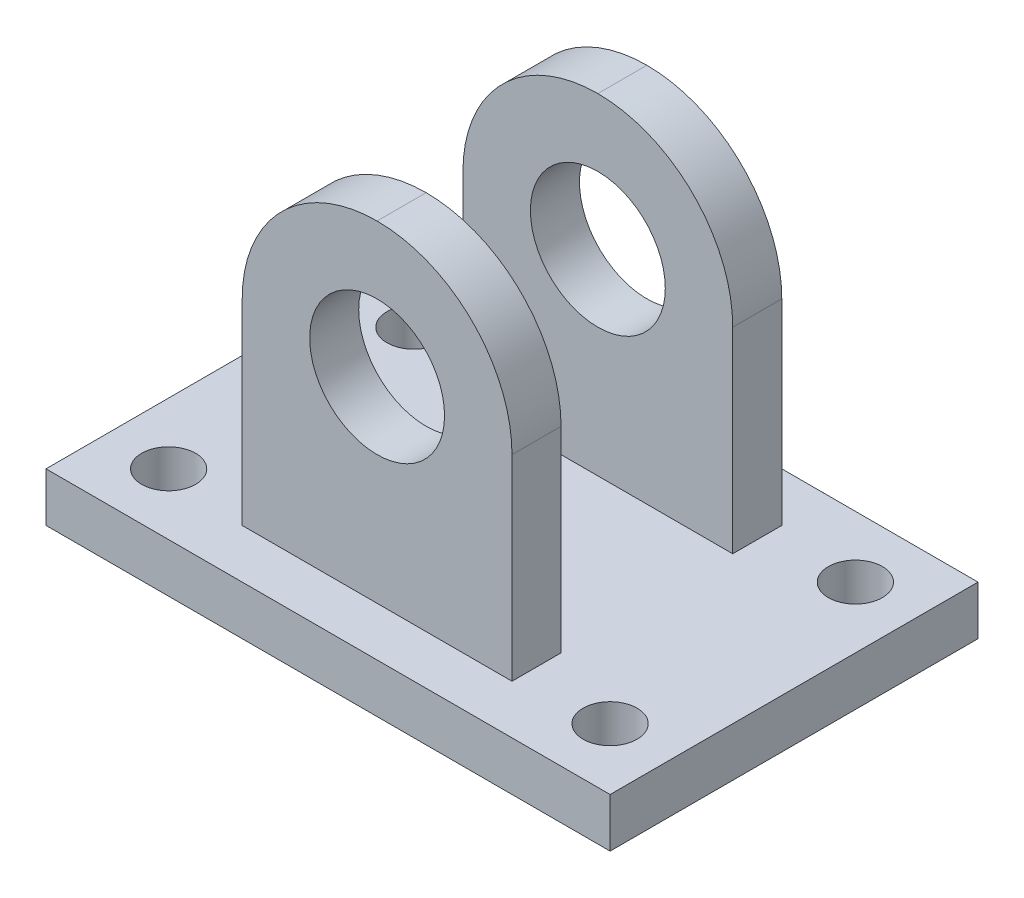
ISO-10303-21;
HEADER;
FILE_DESCRIPTION(('STEP AP214'),'2;1');
FILE_NAME('part.step','',(''),(''),'','','');
FILE_SCHEMA(('AUTOMOTIVE_DESIGN { 1 0 10303 214 1 1 1 1 }'));
ENDSEC;
DATA;
#1=APPLICATION_CONTEXT('core data for automotive mechanical design processes');
#2=APPLICATION_PROTOCOL_DEFINITION('international standard','automotive_design',2000,#1);
#3=PRODUCT_CONTEXT('',#1,'mechanical');
#4=PRODUCT('Part','Part','',(#3));
#5=PRODUCT_RELATED_PRODUCT_CATEGORY('part','',(#4));
#6=PRODUCT_DEFINITION_FORMATION('','',#4);
#7=PRODUCT_DEFINITION_CONTEXT('part definition',#1,'design');
#8=PRODUCT_DEFINITION('design','',#6,#7);
#9=PRODUCT_DEFINITION_SHAPE('','',#8);
#10=(LENGTH_UNIT() NAMED_UNIT(*) SI_UNIT(.MILLI.,.METRE.));
#11=(NAMED_UNIT(*) PLANE_ANGLE_UNIT() SI_UNIT($,.RADIAN.));
#12=(NAMED_UNIT(*) SI_UNIT($,.STERADIAN.) SOLID_ANGLE_UNIT());
#13=UNCERTAINTY_MEASURE_WITH_UNIT(LENGTH_MEASURE(1.E-05),#10,'distance_accuracy_value','');
#14=(GEOMETRIC_REPRESENTATION_CONTEXT(3) GLOBAL_UNCERTAINTY_ASSIGNED_CONTEXT((#13)) GLOBAL_UNIT_ASSIGNED_CONTEXT((#10,
#11,#12)) REPRESENTATION_CONTEXT('',''));
#15=CARTESIAN_POINT('',(0.,0.,0.));
#16=DIRECTION('',(0.,0.,1.));
#17=DIRECTION('',(1.,0.,0.));
#18=AXIS2_PLACEMENT_3D('',#15,#16,#17);
#19=CARTESIAN_POINT('',(90.,0.,50.));
#20=DIRECTION('',(0.,1.,0.));
#21=DIRECTION('',(0.,0.,1.));
#22=AXIS2_PLACEMENT_3D('',#19,#20,#21);
#23=CYLINDRICAL_SURFACE('',#22,11.);
#24=CARTESIAN_POINT('',(90.,0.,50.));
#25=DIRECTION('',(0.,1.,0.));
#26=DIRECTION('',(0.,0.,1.));
#27=AXIS2_PLACEMENT_3D('',#24,#25,#26);
#28=CIRCLE('',#27,11.);
#29=CARTESIAN_POINT('',(90.,0.,61.));
#30=VERTEX_POINT('',#29);
#31=EDGE_CURVE('E42',#30,#30,#28,.T.);
#32=ORIENTED_EDGE('',*,*,#31,.F.);
#33=EDGE_LOOP('',(#32));
#34=FACE_BOUND('',#33,.T.);
#35=CARTESIAN_POINT('',(90.,20.,50.));
#36=DIRECTION('',(0.,1.,0.));
#37=DIRECTION('',(0.,0.,1.));
#38=AXIS2_PLACEMENT_3D('',#35,#36,#37);
#39=CIRCLE('',#38,11.);
#40=CARTESIAN_POINT('',(90.,20.,61.));
#41=VERTEX_POINT('',#40);
#42=EDGE_CURVE('E11',#41,#41,#39,.T.);
#43=ORIENTED_EDGE('',*,*,#42,.T.);
#44=EDGE_LOOP('',(#43));
#45=FACE_BOUND('',#44,.T.);
#46=ADVANCED_FACE('F35',(#34,#45),#23,.F.);
#47=CARTESIAN_POINT('',(-90.,0.,50.));
#48=DIRECTION('',(0.,1.,0.));
#49=DIRECTION('',(0.,0.,1.));
#50=AXIS2_PLACEMENT_3D('',#47,#48,#49);
#51=CYLINDRICAL_SURFACE('',#50,11.);
#52=CARTESIAN_POINT('',(-90.,0.,50.));
#53=DIRECTION('',(0.,1.,0.));
#54=DIRECTION('',(0.,0.,1.));
#55=AXIS2_PLACEMENT_3D('',#52,#53,#54);
#56=CIRCLE('',#55,11.);
#57=CARTESIAN_POINT('',(-90.,0.,61.));
#58=VERTEX_POINT('',#57);
#59=EDGE_CURVE('E243',#58,#58,#56,.T.);
#60=ORIENTED_EDGE('',*,*,#59,.F.);
#61=EDGE_LOOP('',(#60));
#62=FACE_BOUND('',#61,.T.);
#63=CARTESIAN_POINT('',(-90.,20.,50.));
#64=DIRECTION('',(0.,1.,0.));
#65=DIRECTION('',(0.,0.,1.));
#66=AXIS2_PLACEMENT_3D('',#63,#64,#65);
#67=CIRCLE('',#66,11.);
#68=CARTESIAN_POINT('',(-90.,20.,61.));
#69=VERTEX_POINT('',#68);
#70=EDGE_CURVE('E257',#69,#69,#67,.T.);
#71=ORIENTED_EDGE('',*,*,#70,.T.);
#72=EDGE_LOOP('',(#71));
#73=FACE_BOUND('',#72,.T.);
#74=ADVANCED_FACE('F266',(#62,#73),#51,.F.);
#75=CARTESIAN_POINT('',(0.,20.,0.));
#76=DIRECTION('',(0.,1.,0.));
#77=DIRECTION('',(0.,0.,1.));
#78=AXIS2_PLACEMENT_3D('',#75,#76,#77);
#79=PLANE('',#78);
#80=CARTESIAN_POINT('',(90.,20.,-50.));
#81=DIRECTION('',(0.,1.,0.));
#82=DIRECTION('',(0.,0.,1.));
#83=AXIS2_PLACEMENT_3D('',#80,#81,#82);
#84=CIRCLE('',#83,11.);
#85=CARTESIAN_POINT('',(90.,20.,-39.));
#86=VERTEX_POINT('',#85);
#87=EDGE_CURVE('E333',#86,#86,#84,.T.);
#88=ORIENTED_EDGE('',*,*,#87,.F.);
#89=EDGE_LOOP('',(#88));
#90=FACE_BOUND('',#89,.T.);
#91=CARTESIAN_POINT('',(-90.,20.,-50.));
#92=DIRECTION('',(0.,1.,0.));
#93=DIRECTION('',(0.,0.,1.));
#94=AXIS2_PLACEMENT_3D('',#91,#92,#93);
#95=CIRCLE('',#94,11.);
#96=CARTESIAN_POINT('',(-90.,20.,-39.));
#97=VERTEX_POINT('',#96);
#98=EDGE_CURVE('E330',#97,#97,#95,.T.);
#99=ORIENTED_EDGE('',*,*,#98,.F.);
#100=EDGE_LOOP('',(#99));
#101=FACE_BOUND('',#100,.T.);
#102=DIRECTION('',(0.,0.,-1.));
#103=VECTOR('',#102,1.);
#104=CARTESIAN_POINT('',(-55.,20.,55.));
#105=LINE('',#104,#103);
#106=CARTESIAN_POINT('',(-55.,20.,55.));
#107=VERTEX_POINT('',#106);
#108=CARTESIAN_POINT('',(-55.,20.,35.));
#109=VERTEX_POINT('',#108);
#110=EDGE_CURVE('E141',#107,#109,#105,.T.);
#111=ORIENTED_EDGE('',*,*,#110,.T.);
#112=DIRECTION('',(1.,0.,0.));
#113=VECTOR('',#112,1.);
#114=CARTESIAN_POINT('',(-55.,20.,35.));
#115=LINE('',#114,#113);
#116=CARTESIAN_POINT('',(55.,20.,35.));
#117=VERTEX_POINT('',#116);
#118=EDGE_CURVE('E147',#109,#117,#115,.T.);
#119=ORIENTED_EDGE('',*,*,#118,.T.);
#120=DIRECTION('',(0.,0.,1.));
#121=VECTOR('',#120,1.);
#122=CARTESIAN_POINT('',(55.,20.,55.));
#123=LINE('',#122,#121);
#124=CARTESIAN_POINT('',(55.,20.,55.));
#125=VERTEX_POINT('',#124);
#126=EDGE_CURVE('E161',#117,#125,#123,.T.);
#127=ORIENTED_EDGE('',*,*,#126,.T.);
#128=DIRECTION('',(-1.,0.,0.));
#129=VECTOR('',#128,1.);
#130=CARTESIAN_POINT('',(-55.,20.,55.));
#131=LINE('',#130,#129);
#132=EDGE_CURVE('E157',#125,#107,#131,.T.);
#133=ORIENTED_EDGE('',*,*,#132,.T.);
#134=EDGE_LOOP('',(#111,#119,#127,#133));
#135=FACE_BOUND('',#134,.T.);
#136=DIRECTION('',(0.,0.,1.));
#137=VECTOR('',#136,1.);
#138=CARTESIAN_POINT('',(-115.,20.,75.));
#139=LINE('',#138,#137);
#140=CARTESIAN_POINT('',(-115.,20.,-75.));
#141=VERTEX_POINT('',#140);
#142=CARTESIAN_POINT('',(-115.,20.,75.));
#143=VERTEX_POINT('',#142);
#144=EDGE_CURVE('E192',#141,#143,#139,.T.);
#145=ORIENTED_EDGE('',*,*,#144,.T.);
#146=DIRECTION('',(1.,0.,0.));
#147=VECTOR('',#146,1.);
#148=CARTESIAN_POINT('',(115.,20.,75.));
#149=LINE('',#148,#147);
#150=CARTESIAN_POINT('',(115.,20.,75.));
#151=VERTEX_POINT('',#150);
#152=EDGE_CURVE('E195',#143,#151,#149,.T.);
#153=ORIENTED_EDGE('',*,*,#152,.T.);
#154=DIRECTION('',(0.,0.,-1.));
#155=VECTOR('',#154,1.);
#156=CARTESIAN_POINT('',(115.,20.,75.));
#157=LINE('',#156,#155);
#158=CARTESIAN_POINT('',(115.,20.,-75.));
#159=VERTEX_POINT('',#158);
#160=EDGE_CURVE('E198',#151,#159,#157,.T.);
#161=ORIENTED_EDGE('',*,*,#160,.T.);
#162=DIRECTION('',(-1.,0.,0.));
#163=VECTOR('',#162,1.);
#164=CARTESIAN_POINT('',(115.,20.,-75.));
#165=LINE('',#164,#163);
#166=EDGE_CURVE('E200',#159,#141,#165,.T.);
#167=ORIENTED_EDGE('',*,*,#166,.T.);
#168=EDGE_LOOP('',(#145,#153,#161,#167));
#169=FACE_BOUND('',#168,.T.);
#170=DIRECTION('',(1.,0.,0.));
#171=VECTOR('',#170,1.);
#172=CARTESIAN_POINT('',(-55.,20.,-35.));
#173=LINE('',#172,#171);
#174=CARTESIAN_POINT('',(-55.,20.,-35.));
#175=VERTEX_POINT('',#174);
#176=CARTESIAN_POINT('',(55.,20.,-35.));
#177=VERTEX_POINT('',#176);
#178=EDGE_CURVE('E174',#175,#177,#173,.T.);
#179=ORIENTED_EDGE('',*,*,#178,.F.);
#180=DIRECTION('',(0.,0.,1.));
#181=VECTOR('',#180,1.);
#182=CARTESIAN_POINT('',(-55.,20.,-55.));
#183=LINE('',#182,#181);
#184=CARTESIAN_POINT('',(-55.,20.,-55.));
#185=VERTEX_POINT('',#184);
#186=EDGE_CURVE('E171',#185,#175,#183,.T.);
#187=ORIENTED_EDGE('',*,*,#186,.F.);
#188=DIRECTION('',(-1.,0.,0.));
#189=VECTOR('',#188,1.);
#190=CARTESIAN_POINT('',(-55.,20.,-55.));
#191=LINE('',#190,#189);
#192=CARTESIAN_POINT('',(55.,20.,-55.));
#193=VERTEX_POINT('',#192);
#194=EDGE_CURVE('E180',#193,#185,#191,.T.);
#195=ORIENTED_EDGE('',*,*,#194,.F.);
#196=DIRECTION('',(0.,0.,-1.));
#197=VECTOR('',#196,1.);
#198=CARTESIAN_POINT('',(55.,20.,-55.));
#199=LINE('',#198,#197);
#200=EDGE_CURVE('E177',#177,#193,#199,.T.);
#201=ORIENTED_EDGE('',*,*,#200,.F.);
#202=EDGE_LOOP('',(#179,#187,#195,#201));
#203=FACE_BOUND('',#202,.T.);
#204=ORIENTED_EDGE('',*,*,#70,.F.);
#205=EDGE_LOOP('',(#204));
#206=FACE_BOUND('',#205,.T.);
#207=ORIENTED_EDGE('',*,*,#42,.F.);
#208=EDGE_LOOP('',(#207));
#209=FACE_BOUND('',#208,.T.);
#210=ADVANCED_FACE('F152',(#90,#101,#135,#169,#203,#206,#209),#79,.T.);
#211=CARTESIAN_POINT('',(-115.,20.,75.));
#212=DIRECTION('',(1.,0.,0.));
#213=DIRECTION('',(0.,0.,-1.));
#214=AXIS2_PLACEMENT_3D('',#211,#212,#213);
#215=PLANE('',#214);
#216=DIRECTION('',(0.,0.,1.));
#217=VECTOR('',#216,1.);
#218=CARTESIAN_POINT('',(-115.,0.,75.));
#219=LINE('',#218,#217);
#220=CARTESIAN_POINT('',(-115.,0.,-75.));
#221=VERTEX_POINT('',#220);
#222=CARTESIAN_POINT('',(-115.,0.,75.));
#223=VERTEX_POINT('',#222);
#224=EDGE_CURVE('E191',#221,#223,#219,.T.);
#225=ORIENTED_EDGE('',*,*,#224,.T.);
#226=DIRECTION('',(0.,-1.,0.));
#227=VECTOR('',#226,1.);
#228=CARTESIAN_POINT('',(-115.,20.,75.));
#229=LINE('',#228,#227);
#230=EDGE_CURVE('E218',#143,#223,#229,.T.);
#231=ORIENTED_EDGE('',*,*,#230,.F.);
#232=ORIENTED_EDGE('',*,*,#144,.F.);
#233=DIRECTION('',(0.,-1.,0.));
#234=VECTOR('',#233,1.);
#235=CARTESIAN_POINT('',(-115.,20.,-75.));
#236=LINE('',#235,#234);
#237=EDGE_CURVE('E202',#141,#221,#236,.T.);
#238=ORIENTED_EDGE('',*,*,#237,.T.);
#239=EDGE_LOOP('',(#225,#231,#232,#238));
#240=FACE_BOUND('',#239,.T.);
#241=ADVANCED_FACE('F270',(#240),#215,.F.);
#242=CARTESIAN_POINT('',(115.,20.,75.));
#243=DIRECTION('',(0.,0.,-1.));
#244=DIRECTION('',(-1.,0.,0.));
#245=AXIS2_PLACEMENT_3D('',#242,#243,#244);
#246=PLANE('',#245);
#247=DIRECTION('',(1.,0.,0.));
#248=VECTOR('',#247,1.);
#249=CARTESIAN_POINT('',(115.,0.,75.));
#250=LINE('',#249,#248);
#251=CARTESIAN_POINT('',(115.,0.,75.));
#252=VERTEX_POINT('',#251);
#253=EDGE_CURVE('E205',#223,#252,#250,.T.);
#254=ORIENTED_EDGE('',*,*,#253,.T.);
#255=DIRECTION('',(0.,-1.,0.));
#256=VECTOR('',#255,1.);
#257=CARTESIAN_POINT('',(115.,20.,75.));
#258=LINE('',#257,#256);
#259=EDGE_CURVE('E215',#151,#252,#258,.T.);
#260=ORIENTED_EDGE('',*,*,#259,.F.);
#261=ORIENTED_EDGE('',*,*,#152,.F.);
#262=ORIENTED_EDGE('',*,*,#230,.T.);
#263=EDGE_LOOP('',(#254,#260,#261,#262));
#264=FACE_BOUND('',#263,.T.);
#265=ADVANCED_FACE('F277',(#264),#246,.F.);
#266=CARTESIAN_POINT('',(115.,20.,75.));
#267=DIRECTION('',(-1.,0.,0.));
#268=DIRECTION('',(0.,0.,1.));
#269=AXIS2_PLACEMENT_3D('',#266,#267,#268);
#270=PLANE('',#269);
#271=DIRECTION('',(0.,0.,-1.));
#272=VECTOR('',#271,1.);
#273=CARTESIAN_POINT('',(115.,0.,75.));
#274=LINE('',#273,#272);
#275=CARTESIAN_POINT('',(115.,0.,-75.));
#276=VERTEX_POINT('',#275);
#277=EDGE_CURVE('E207',#252,#276,#274,.T.);
#278=ORIENTED_EDGE('',*,*,#277,.T.);
#279=DIRECTION('',(0.,-1.,0.));
#280=VECTOR('',#279,1.);
#281=CARTESIAN_POINT('',(115.,20.,-75.));
#282=LINE('',#281,#280);
#283=EDGE_CURVE('E212',#159,#276,#282,.T.);
#284=ORIENTED_EDGE('',*,*,#283,.F.);
#285=ORIENTED_EDGE('',*,*,#160,.F.);
#286=ORIENTED_EDGE('',*,*,#259,.T.);
#287=EDGE_LOOP('',(#278,#284,#285,#286));
#288=FACE_BOUND('',#287,.T.);
#289=ADVANCED_FACE('F293',(#288),#270,.F.);
#290=CARTESIAN_POINT('',(115.,20.,-75.));
#291=DIRECTION('',(0.,0.,1.));
#292=DIRECTION('',(1.,0.,0.));
#293=AXIS2_PLACEMENT_3D('',#290,#291,#292);
#294=PLANE('',#293);
#295=DIRECTION('',(-1.,0.,0.));
#296=VECTOR('',#295,1.);
#297=CARTESIAN_POINT('',(115.,0.,-75.));
#298=LINE('',#297,#296);
#299=EDGE_CURVE('E196',#276,#221,#298,.T.);
#300=ORIENTED_EDGE('',*,*,#299,.T.);
#301=ORIENTED_EDGE('',*,*,#237,.F.);
#302=ORIENTED_EDGE('',*,*,#166,.F.);
#303=ORIENTED_EDGE('',*,*,#283,.T.);
#304=EDGE_LOOP('',(#300,#301,#302,#303));
#305=FACE_BOUND('',#304,.T.);
#306=ADVANCED_FACE('F289',(#305),#294,.F.);
#307=CARTESIAN_POINT('',(0.,0.,0.));
#308=DIRECTION('',(0.,1.,0.));
#309=DIRECTION('',(0.,0.,1.));
#310=AXIS2_PLACEMENT_3D('',#307,#308,#309);
#311=PLANE('',#310);
#312=CARTESIAN_POINT('',(90.,0.,-50.));
#313=DIRECTION('',(0.,1.,0.));
#314=DIRECTION('',(0.,0.,1.));
#315=AXIS2_PLACEMENT_3D('',#312,#313,#314);
#316=CIRCLE('',#315,11.);
#317=CARTESIAN_POINT('',(90.,0.,-39.));
#318=VERTEX_POINT('',#317);
#319=EDGE_CURVE('E338',#318,#318,#316,.T.);
#320=ORIENTED_EDGE('',*,*,#319,.T.);
#321=EDGE_LOOP('',(#320));
#322=FACE_BOUND('',#321,.T.);
#323=CARTESIAN_POINT('',(-90.,0.,-50.));
#324=DIRECTION('',(0.,1.,0.));
#325=DIRECTION('',(0.,0.,1.));
#326=AXIS2_PLACEMENT_3D('',#323,#324,#325);
#327=CIRCLE('',#326,11.);
#328=CARTESIAN_POINT('',(-90.,0.,-39.));
#329=VERTEX_POINT('',#328);
#330=EDGE_CURVE('E329',#329,#329,#327,.T.);
#331=ORIENTED_EDGE('',*,*,#330,.T.);
#332=EDGE_LOOP('',(#331));
#333=FACE_BOUND('',#332,.T.);
#334=ORIENTED_EDGE('',*,*,#224,.F.);
#335=ORIENTED_EDGE('',*,*,#299,.F.);
#336=ORIENTED_EDGE('',*,*,#277,.F.);
#337=ORIENTED_EDGE('',*,*,#253,.F.);
#338=EDGE_LOOP('',(#334,#335,#336,#337));
#339=FACE_BOUND('',#338,.T.);
#340=ORIENTED_EDGE('',*,*,#59,.T.);
#341=EDGE_LOOP('',(#340));
#342=FACE_BOUND('',#341,.T.);
#343=ORIENTED_EDGE('',*,*,#31,.T.);
#344=EDGE_LOOP('',(#343));
#345=FACE_BOUND('',#344,.T.);
#346=ADVANCED_FACE('F262',(#322,#333,#339,#342,#345),#311,.F.);
#347=CARTESIAN_POINT('',(-55.,155.,-55.));
#348=DIRECTION('',(1.,0.,0.));
#349=DIRECTION('',(0.,0.,-1.));
#350=AXIS2_PLACEMENT_3D('',#347,#348,#349);
#351=PLANE('',#350);
#352=DIRECTION('',(0.,-1.,0.));
#353=VECTOR('',#352,1.);
#354=CARTESIAN_POINT('',(-55.,155.,-35.));
#355=LINE('',#354,#353);
#356=CARTESIAN_POINT('',(-55.,100.,-35.));
#357=VERTEX_POINT('',#356);
#358=EDGE_CURVE('E189',#357,#175,#355,.T.);
#359=ORIENTED_EDGE('',*,*,#358,.F.);
#360=DIRECTION('',(0.,0.,1.));
#361=VECTOR('',#360,1.);
#362=CARTESIAN_POINT('',(-55.,100.,-55.));
#363=LINE('',#362,#361);
#364=CARTESIAN_POINT('',(-55.,100.,-55.));
#365=VERTEX_POINT('',#364);
#366=EDGE_CURVE('E225',#357,#365,#363,.F.);
#367=ORIENTED_EDGE('',*,*,#366,.T.);
#368=DIRECTION('',(0.,-1.,0.));
#369=VECTOR('',#368,1.);
#370=CARTESIAN_POINT('',(-55.,155.,-55.));
#371=LINE('',#370,#369);
#372=EDGE_CURVE('E183',#365,#185,#371,.T.);
#373=ORIENTED_EDGE('',*,*,#372,.T.);
#374=ORIENTED_EDGE('',*,*,#186,.T.);
#375=EDGE_LOOP('',(#359,#367,#373,#374));
#376=FACE_BOUND('',#375,.T.);
#377=ADVANCED_FACE('F285',(#376),#351,.F.);
#378=CARTESIAN_POINT('',(-55.,155.,-35.));
#379=DIRECTION('',(0.,0.,-1.));
#380=DIRECTION('',(-1.,0.,0.));
#381=AXIS2_PLACEMENT_3D('',#378,#379,#380);
#382=PLANE('',#381);
#383=CARTESIAN_POINT('',(0.,100.,-35.));
#384=DIRECTION('',(0.,0.,-1.));
#385=DIRECTION('',(-1.,0.,0.));
#386=AXIS2_PLACEMENT_3D('',#383,#384,#385);
#387=CIRCLE('',#386,27.5);
#388=CARTESIAN_POINT('',(-27.5,100.,-35.));
#389=VERTEX_POINT('',#388);
#390=EDGE_CURVE('E249',#389,#389,#387,.T.);
#391=ORIENTED_EDGE('',*,*,#390,.T.);
#392=EDGE_LOOP('',(#391));
#393=FACE_BOUND('',#392,.T.);
#394=CARTESIAN_POINT('',(0.,100.,-35.));
#395=DIRECTION('',(0.,0.,-1.));
#396=DIRECTION('',(-1.,0.,0.));
#397=AXIS2_PLACEMENT_3D('',#394,#395,#396);
#398=CIRCLE('',#397,55.);
#399=CARTESIAN_POINT('',(55.,100.,-35.));
#400=VERTEX_POINT('',#399);
#401=CARTESIAN_POINT('',(0.,155.,-35.));
#402=VERTEX_POINT('',#401);
#403=EDGE_CURVE('E221',#400,#402,#398,.F.);
#404=ORIENTED_EDGE('',*,*,#403,.T.);
#405=CARTESIAN_POINT('',(0.,100.,-35.));
#406=DIRECTION('',(0.,0.,-1.));
#407=DIRECTION('',(-1.,0.,0.));
#408=AXIS2_PLACEMENT_3D('',#405,#406,#407);
#409=CIRCLE('',#408,55.);
#410=EDGE_CURVE('E223',#402,#357,#409,.F.);
#411=ORIENTED_EDGE('',*,*,#410,.T.);
#412=ORIENTED_EDGE('',*,*,#358,.T.);
#413=ORIENTED_EDGE('',*,*,#178,.T.);
#414=DIRECTION('',(0.,-1.,0.));
#415=VECTOR('',#414,1.);
#416=CARTESIAN_POINT('',(55.,155.,-35.));
#417=LINE('',#416,#415);
#418=EDGE_CURVE('E187',#400,#177,#417,.T.);
#419=ORIENTED_EDGE('',*,*,#418,.F.);
#420=EDGE_LOOP('',(#404,#411,#412,#413,#419));
#421=FACE_BOUND('',#420,.T.);
#422=ADVANCED_FACE('F375',(#393,#421),#382,.F.);
#423=CARTESIAN_POINT('',(55.,155.,-55.));
#424=DIRECTION('',(-1.,0.,0.));
#425=DIRECTION('',(0.,0.,1.));
#426=AXIS2_PLACEMENT_3D('',#423,#424,#425);
#427=PLANE('',#426);
#428=DIRECTION('',(0.,-1.,0.));
#429=VECTOR('',#428,1.);
#430=CARTESIAN_POINT('',(55.,155.,-55.));
#431=LINE('',#430,#429);
#432=CARTESIAN_POINT('',(55.,100.,-55.));
#433=VERTEX_POINT('',#432);
#434=EDGE_CURVE('E185',#433,#193,#431,.T.);
#435=ORIENTED_EDGE('',*,*,#434,.F.);
#436=DIRECTION('',(0.,0.,-1.));
#437=VECTOR('',#436,1.);
#438=CARTESIAN_POINT('',(55.,100.,-35.));
#439=LINE('',#438,#437);
#440=EDGE_CURVE('E232',#433,#400,#439,.F.);
#441=ORIENTED_EDGE('',*,*,#440,.T.);
#442=ORIENTED_EDGE('',*,*,#418,.T.);
#443=ORIENTED_EDGE('',*,*,#200,.T.);
#444=EDGE_LOOP('',(#435,#441,#442,#443));
#445=FACE_BOUND('',#444,.T.);
#446=ADVANCED_FACE('F372',(#445),#427,.F.);
#447=CARTESIAN_POINT('',(-55.,155.,-55.));
#448=DIRECTION('',(0.,0.,1.));
#449=DIRECTION('',(1.,0.,0.));
#450=AXIS2_PLACEMENT_3D('',#447,#448,#449);
#451=PLANE('',#450);
#452=CARTESIAN_POINT('',(0.,100.,-55.));
#453=DIRECTION('',(0.,0.,1.));
#454=DIRECTION('',(1.,0.,0.));
#455=AXIS2_PLACEMENT_3D('',#452,#453,#454);
#456=CIRCLE('',#455,27.5);
#457=CARTESIAN_POINT('',(27.5,100.,-55.));
#458=VERTEX_POINT('',#457);
#459=EDGE_CURVE('E253',#458,#458,#456,.T.);
#460=ORIENTED_EDGE('',*,*,#459,.T.);
#461=EDGE_LOOP('',(#460));
#462=FACE_BOUND('',#461,.T.);
#463=ORIENTED_EDGE('',*,*,#372,.F.);
#464=CARTESIAN_POINT('',(0.,100.,-55.));
#465=DIRECTION('',(0.,0.,1.));
#466=DIRECTION('',(1.,0.,0.));
#467=AXIS2_PLACEMENT_3D('',#464,#465,#466);
#468=CIRCLE('',#467,55.);
#469=CARTESIAN_POINT('',(0.,155.,-55.));
#470=VERTEX_POINT('',#469);
#471=EDGE_CURVE('E230',#365,#470,#468,.F.);
#472=ORIENTED_EDGE('',*,*,#471,.T.);
#473=CARTESIAN_POINT('',(0.,100.,-55.));
#474=DIRECTION('',(0.,0.,1.));
#475=DIRECTION('',(1.,0.,0.));
#476=AXIS2_PLACEMENT_3D('',#473,#474,#475);
#477=CIRCLE('',#476,55.);
#478=EDGE_CURVE('E228',#470,#433,#477,.F.);
#479=ORIENTED_EDGE('',*,*,#478,.T.);
#480=ORIENTED_EDGE('',*,*,#434,.T.);
#481=ORIENTED_EDGE('',*,*,#194,.T.);
#482=EDGE_LOOP('',(#463,#472,#479,#480,#481));
#483=FACE_BOUND('',#482,.T.);
#484=ADVANCED_FACE('F369',(#462,#483),#451,.F.);
#485=CARTESIAN_POINT('',(-55.,155.,55.));
#486=DIRECTION('',(-1.,0.,0.));
#487=DIRECTION('',(0.,0.,1.));
#488=AXIS2_PLACEMENT_3D('',#485,#486,#487);
#489=PLANE('',#488);
#490=DIRECTION('',(0.,-1.,0.));
#491=VECTOR('',#490,1.);
#492=CARTESIAN_POINT('',(-55.,155.,55.));
#493=LINE('',#492,#491);
#494=CARTESIAN_POINT('',(-55.,100.,55.));
#495=VERTEX_POINT('',#494);
#496=EDGE_CURVE('E169',#495,#107,#493,.T.);
#497=ORIENTED_EDGE('',*,*,#496,.F.);
#498=DIRECTION('',(0.,0.,-1.));
#499=VECTOR('',#498,1.);
#500=CARTESIAN_POINT('',(-55.,100.,55.));
#501=LINE('',#500,#499);
#502=CARTESIAN_POINT('',(-55.,100.,35.));
#503=VERTEX_POINT('',#502);
#504=EDGE_CURVE('E143',#495,#503,#501,.T.);
#505=ORIENTED_EDGE('',*,*,#504,.T.);
#506=DIRECTION('',(0.,-1.,0.));
#507=VECTOR('',#506,1.);
#508=CARTESIAN_POINT('',(-55.,155.,35.));
#509=LINE('',#508,#507);
#510=EDGE_CURVE('E137',#503,#109,#509,.T.);
#511=ORIENTED_EDGE('',*,*,#510,.T.);
#512=ORIENTED_EDGE('',*,*,#110,.F.);
#513=EDGE_LOOP('',(#497,#505,#511,#512));
#514=FACE_BOUND('',#513,.T.);
#515=ADVANCED_FACE('F140',(#514),#489,.T.);
#516=CARTESIAN_POINT('',(-55.,155.,55.));
#517=DIRECTION('',(0.,0.,1.));
#518=DIRECTION('',(1.,0.,0.));
#519=AXIS2_PLACEMENT_3D('',#516,#517,#518);
#520=PLANE('',#519);
#521=CARTESIAN_POINT('',(0.,100.,55.));
#522=DIRECTION('',(0.,0.,1.));
#523=DIRECTION('',(1.,0.,0.));
#524=AXIS2_PLACEMENT_3D('',#521,#522,#523);
#525=CIRCLE('',#524,27.5);
#526=CARTESIAN_POINT('',(27.5,100.,55.));
#527=VERTEX_POINT('',#526);
#528=EDGE_CURVE('E254',#527,#527,#525,.T.);
#529=ORIENTED_EDGE('',*,*,#528,.F.);
#530=EDGE_LOOP('',(#529));
#531=FACE_BOUND('',#530,.T.);
#532=CARTESIAN_POINT('',(0.,100.,55.));
#533=DIRECTION('',(0.,0.,1.));
#534=DIRECTION('',(1.,0.,0.));
#535=AXIS2_PLACEMENT_3D('',#532,#533,#534);
#536=CIRCLE('',#535,55.);
#537=CARTESIAN_POINT('',(55.,100.,55.));
#538=VERTEX_POINT('',#537);
#539=CARTESIAN_POINT('',(0.,155.,55.));
#540=VERTEX_POINT('',#539);
#541=EDGE_CURVE('E49',#538,#540,#536,.T.);
#542=ORIENTED_EDGE('',*,*,#541,.T.);
#543=CARTESIAN_POINT('',(0.,100.,55.));
#544=DIRECTION('',(0.,0.,1.));
#545=DIRECTION('',(1.,0.,0.));
#546=AXIS2_PLACEMENT_3D('',#543,#544,#545);
#547=CIRCLE('',#546,55.);
#548=EDGE_CURVE('E240',#540,#495,#547,.T.);
#549=ORIENTED_EDGE('',*,*,#548,.T.);
#550=ORIENTED_EDGE('',*,*,#496,.T.);
#551=ORIENTED_EDGE('',*,*,#132,.F.);
#552=DIRECTION('',(0.,-1.,0.));
#553=VECTOR('',#552,1.);
#554=CARTESIAN_POINT('',(55.,155.,55.));
#555=LINE('',#554,#553);
#556=EDGE_CURVE('E167',#538,#125,#555,.T.);
#557=ORIENTED_EDGE('',*,*,#556,.F.);
#558=EDGE_LOOP('',(#542,#549,#550,#551,#557));
#559=FACE_BOUND('',#558,.T.);
#560=ADVANCED_FACE('F321',(#531,#559),#520,.T.);
#561=CARTESIAN_POINT('',(55.,155.,55.));
#562=DIRECTION('',(1.,0.,0.));
#563=DIRECTION('',(0.,0.,-1.));
#564=AXIS2_PLACEMENT_3D('',#561,#562,#563);
#565=PLANE('',#564);
#566=DIRECTION('',(0.,-1.,0.));
#567=VECTOR('',#566,1.);
#568=CARTESIAN_POINT('',(55.,155.,35.));
#569=LINE('',#568,#567);
#570=CARTESIAN_POINT('',(55.,100.,35.));
#571=VERTEX_POINT('',#570);
#572=EDGE_CURVE('E146',#571,#117,#569,.T.);
#573=ORIENTED_EDGE('',*,*,#572,.F.);
#574=DIRECTION('',(0.,0.,1.));
#575=VECTOR('',#574,1.);
#576=CARTESIAN_POINT('',(55.,100.,55.));
#577=LINE('',#576,#575);
#578=EDGE_CURVE('E57',#571,#538,#577,.T.);
#579=ORIENTED_EDGE('',*,*,#578,.T.);
#580=ORIENTED_EDGE('',*,*,#556,.T.);
#581=ORIENTED_EDGE('',*,*,#126,.F.);
#582=EDGE_LOOP('',(#573,#579,#580,#581));
#583=FACE_BOUND('',#582,.T.);
#584=ADVANCED_FACE('F360',(#583),#565,.T.);
#585=CARTESIAN_POINT('',(-55.,155.,35.));
#586=DIRECTION('',(0.,0.,-1.));
#587=DIRECTION('',(-1.,0.,0.));
#588=AXIS2_PLACEMENT_3D('',#585,#586,#587);
#589=PLANE('',#588);
#590=CARTESIAN_POINT('',(0.,100.,35.));
#591=DIRECTION('',(0.,0.,-1.));
#592=DIRECTION('',(-1.,0.,0.));
#593=AXIS2_PLACEMENT_3D('',#590,#591,#592);
#594=CIRCLE('',#593,27.5);
#595=CARTESIAN_POINT('',(-27.5,100.,35.));
#596=VERTEX_POINT('',#595);
#597=EDGE_CURVE('E250',#596,#596,#594,.T.);
#598=ORIENTED_EDGE('',*,*,#597,.F.);
#599=EDGE_LOOP('',(#598));
#600=FACE_BOUND('',#599,.T.);
#601=ORIENTED_EDGE('',*,*,#510,.F.);
#602=CARTESIAN_POINT('',(0.,100.,35.));
#603=DIRECTION('',(0.,0.,-1.));
#604=DIRECTION('',(-1.,0.,0.));
#605=AXIS2_PLACEMENT_3D('',#602,#603,#604);
#606=CIRCLE('',#605,55.);
#607=CARTESIAN_POINT('',(0.,155.,35.));
#608=VERTEX_POINT('',#607);
#609=EDGE_CURVE('E237',#503,#608,#606,.T.);
#610=ORIENTED_EDGE('',*,*,#609,.T.);
#611=CARTESIAN_POINT('',(0.,100.,35.));
#612=DIRECTION('',(0.,0.,-1.));
#613=DIRECTION('',(-1.,0.,0.));
#614=AXIS2_PLACEMENT_3D('',#611,#612,#613);
#615=CIRCLE('',#614,55.);
#616=EDGE_CURVE('E235',#608,#571,#615,.T.);
#617=ORIENTED_EDGE('',*,*,#616,.T.);
#618=ORIENTED_EDGE('',*,*,#572,.T.);
#619=ORIENTED_EDGE('',*,*,#118,.F.);
#620=EDGE_LOOP('',(#601,#610,#617,#618,#619));
#621=FACE_BOUND('',#620,.T.);
#622=ADVANCED_FACE('F160',(#600,#621),#589,.T.);
#623=CARTESIAN_POINT('',(0.,100.,0.));
#624=DIRECTION('',(0.,0.,1.));
#625=DIRECTION('',(1.,0.,0.));
#626=AXIS2_PLACEMENT_3D('',#623,#624,#625);
#627=CYLINDRICAL_SURFACE('',#626,55.);
#628=ORIENTED_EDGE('',*,*,#440,.F.);
#629=ORIENTED_EDGE('',*,*,#478,.F.);
#630=DIRECTION('',(0.,0.,-1.));
#631=VECTOR('',#630,1.);
#632=CARTESIAN_POINT('',(0.,155.,-55.));
#633=LINE('',#632,#631);
#634=EDGE_CURVE('E158',#402,#470,#633,.T.);
#635=ORIENTED_EDGE('',*,*,#634,.F.);
#636=ORIENTED_EDGE('',*,*,#403,.F.);
#637=EDGE_LOOP('',(#628,#629,#635,#636));
#638=FACE_BOUND('',#637,.T.);
#639=ADVANCED_FACE('F305',(#638),#627,.T.);
#640=CARTESIAN_POINT('',(0.,100.,0.));
#641=DIRECTION('',(0.,0.,-1.));
#642=DIRECTION('',(-1.,0.,0.));
#643=AXIS2_PLACEMENT_3D('',#640,#641,#642);
#644=CYLINDRICAL_SURFACE('',#643,55.);
#645=ORIENTED_EDGE('',*,*,#471,.F.);
#646=ORIENTED_EDGE('',*,*,#366,.F.);
#647=ORIENTED_EDGE('',*,*,#410,.F.);
#648=ORIENTED_EDGE('',*,*,#634,.T.);
#649=EDGE_LOOP('',(#645,#646,#647,#648));
#650=FACE_BOUND('',#649,.T.);
#651=ADVANCED_FACE('F301',(#650),#644,.T.);
#652=CARTESIAN_POINT('',(0.,100.,55.));
#653=DIRECTION('',(0.,0.,1.));
#654=DIRECTION('',(1.,0.,0.));
#655=AXIS2_PLACEMENT_3D('',#652,#653,#654);
#656=CYLINDRICAL_SURFACE('',#655,55.);
#657=DIRECTION('',(0.,0.,1.));
#658=VECTOR('',#657,1.);
#659=CARTESIAN_POINT('',(0.,155.,0.));
#660=LINE('',#659,#658);
#661=EDGE_CURVE('E246',#540,#608,#660,.F.);
#662=ORIENTED_EDGE('',*,*,#661,.F.);
#663=ORIENTED_EDGE('',*,*,#541,.F.);
#664=ORIENTED_EDGE('',*,*,#578,.F.);
#665=ORIENTED_EDGE('',*,*,#616,.F.);
#666=EDGE_LOOP('',(#662,#663,#664,#665));
#667=FACE_BOUND('',#666,.T.);
#668=ADVANCED_FACE('F304',(#667),#656,.T.);
#669=CARTESIAN_POINT('',(0.,100.,55.));
#670=DIRECTION('',(0.,0.,-1.));
#671=DIRECTION('',(-1.,0.,0.));
#672=AXIS2_PLACEMENT_3D('',#669,#670,#671);
#673=CYLINDRICAL_SURFACE('',#672,55.);
#674=ORIENTED_EDGE('',*,*,#548,.F.);
#675=ORIENTED_EDGE('',*,*,#661,.T.);
#676=ORIENTED_EDGE('',*,*,#609,.F.);
#677=ORIENTED_EDGE('',*,*,#504,.F.);
#678=EDGE_LOOP('',(#674,#675,#676,#677));
#679=FACE_BOUND('',#678,.T.);
#680=ADVANCED_FACE('F310',(#679),#673,.T.);
#681=CARTESIAN_POINT('',(0.,100.,-75.0000000000001));
#682=DIRECTION('',(0.,0.,1.));
#683=DIRECTION('',(1.,0.,0.));
#684=AXIS2_PLACEMENT_3D('',#681,#682,#683);
#685=CYLINDRICAL_SURFACE('',#684,27.5);
#686=ORIENTED_EDGE('',*,*,#597,.T.);
#687=EDGE_LOOP('',(#686));
#688=FACE_BOUND('',#687,.T.);
#689=ORIENTED_EDGE('',*,*,#528,.T.);
#690=EDGE_LOOP('',(#689));
#691=FACE_BOUND('',#690,.T.);
#692=ADVANCED_FACE('F313',(#688,#691),#685,.F.);
#693=ORIENTED_EDGE('',*,*,#459,.F.);
#694=EDGE_LOOP('',(#693));
#695=FACE_BOUND('',#694,.T.);
#696=ORIENTED_EDGE('',*,*,#390,.F.);
#697=EDGE_LOOP('',(#696));
#698=FACE_BOUND('',#697,.T.);
#699=ADVANCED_FACE('F351',(#695,#698),#685,.F.);
#700=CARTESIAN_POINT('',(-90.,0.,-50.));
#701=DIRECTION('',(0.,1.,0.));
#702=DIRECTION('',(0.,0.,1.));
#703=AXIS2_PLACEMENT_3D('',#700,#701,#702);
#704=CYLINDRICAL_SURFACE('',#703,11.);
#705=ORIENTED_EDGE('',*,*,#330,.F.);
#706=EDGE_LOOP('',(#705));
#707=FACE_BOUND('',#706,.T.);
#708=ORIENTED_EDGE('',*,*,#98,.T.);
#709=EDGE_LOOP('',(#708));
#710=FACE_BOUND('',#709,.T.);
#711=ADVANCED_FACE('F346',(#707,#710),#704,.F.);
#712=CARTESIAN_POINT('',(90.,0.,-50.));
#713=DIRECTION('',(0.,1.,0.));
#714=DIRECTION('',(0.,0.,1.));
#715=AXIS2_PLACEMENT_3D('',#712,#713,#714);
#716=CYLINDRICAL_SURFACE('',#715,11.);
#717=ORIENTED_EDGE('',*,*,#319,.F.);
#718=EDGE_LOOP('',(#717));
#719=FACE_BOUND('',#718,.T.);
#720=ORIENTED_EDGE('',*,*,#87,.T.);
#721=EDGE_LOOP('',(#720));
#722=FACE_BOUND('',#721,.T.);
#723=ADVANCED_FACE('F343',(#719,#722),#716,.F.);
#724=CLOSED_SHELL('',(#46,#74,#210,#241,#265,#289,#306,#346,#377,#422,#446,#484,#515,#560,#584,
#622,#639,#651,#668,#680,#692,#699,#711,#723));
#725=MANIFOLD_SOLID_BREP('B2',#724);
#726=ADVANCED_BREP_SHAPE_REPRESENTATION('',(#18,#725),#14);
#727=SHAPE_DEFINITION_REPRESENTATION(#9,#726);
ENDSEC;
END-ISO-10303-21;
